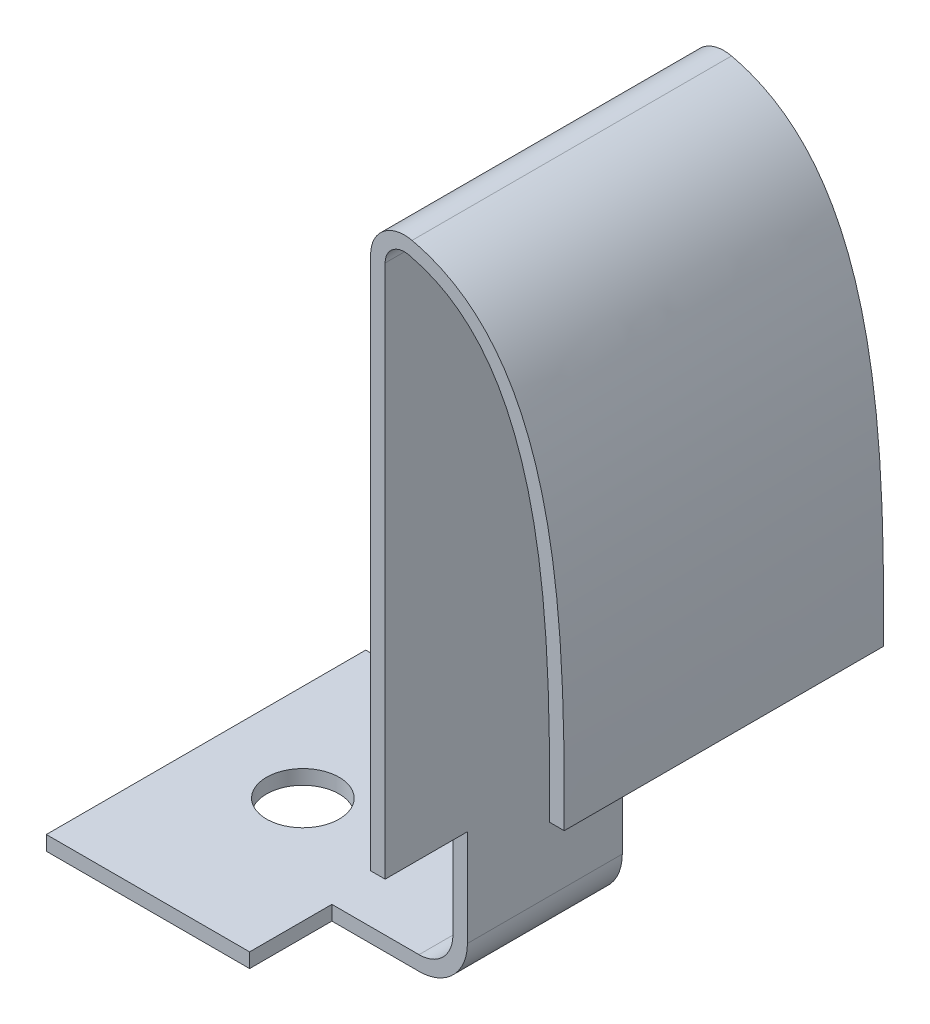
ISO-10303-21;
HEADER;
FILE_DESCRIPTION(('STEP AP214'),'2;1');
FILE_NAME('part.step','',(''),(''),'','','');
FILE_SCHEMA(('AUTOMOTIVE_DESIGN { 1 0 10303 214 1 1 1 1 }'));
ENDSEC;
DATA;
#1=APPLICATION_CONTEXT('core data for automotive mechanical design processes');
#2=APPLICATION_PROTOCOL_DEFINITION('international standard','automotive_design',2000,#1);
#3=PRODUCT_CONTEXT('',#1,'mechanical');
#4=PRODUCT('Part','Part','',(#3));
#5=PRODUCT_RELATED_PRODUCT_CATEGORY('part','',(#4));
#6=PRODUCT_DEFINITION_FORMATION('','',#4);
#7=PRODUCT_DEFINITION_CONTEXT('part definition',#1,'design');
#8=PRODUCT_DEFINITION('design','',#6,#7);
#9=PRODUCT_DEFINITION_SHAPE('','',#8);
#10=(LENGTH_UNIT() NAMED_UNIT(*) SI_UNIT(.MILLI.,.METRE.));
#11=(NAMED_UNIT(*) PLANE_ANGLE_UNIT() SI_UNIT($,.RADIAN.));
#12=(NAMED_UNIT(*) SI_UNIT($,.STERADIAN.) SOLID_ANGLE_UNIT());
#13=UNCERTAINTY_MEASURE_WITH_UNIT(LENGTH_MEASURE(1.E-05),#10,'distance_accuracy_value','');
#14=(GEOMETRIC_REPRESENTATION_CONTEXT(3) GLOBAL_UNCERTAINTY_ASSIGNED_CONTEXT((#13)) GLOBAL_UNIT_ASSIGNED_CONTEXT((#10,
#11,#12)) REPRESENTATION_CONTEXT('',''));
#15=CARTESIAN_POINT('',(0.,0.,0.));
#16=DIRECTION('',(0.,0.,1.));
#17=DIRECTION('',(1.,0.,0.));
#18=AXIS2_PLACEMENT_3D('',#15,#16,#17);
#19=CARTESIAN_POINT('',(-0.7,0.7,3.3));
#20=DIRECTION('',(0.,0.,-1.));
#21=DIRECTION('',(-1.,0.,0.));
#22=AXIS2_PLACEMENT_3D('',#19,#20,#21);
#23=CYLINDRICAL_SURFACE('',#22,1.);
#24=CARTESIAN_POINT('',(-0.7,0.7,-1.6));
#25=DIRECTION('',(0.,0.,-1.));
#26=DIRECTION('',(-1.,0.,0.));
#27=AXIS2_PLACEMENT_3D('',#24,#25,#26);
#28=CIRCLE('',#27,1.);
#29=CARTESIAN_POINT('',(0.3,0.700000000000007,-1.6));
#30=VERTEX_POINT('',#29);
#31=CARTESIAN_POINT('',(-0.700000000000005,-0.3,-1.6));
#32=VERTEX_POINT('',#31);
#33=EDGE_CURVE('E434',#30,#32,#28,.T.);
#34=ORIENTED_EDGE('',*,*,#33,.F.);
#35=DIRECTION('',(0.,0.,-1.));
#36=VECTOR('',#35,1.);
#37=CARTESIAN_POINT('',(0.3,0.700000000000007,3.3));
#38=LINE('',#37,#36);
#39=CARTESIAN_POINT('',(0.3,0.700000000000007,1.6));
#40=VERTEX_POINT('',#39);
#41=EDGE_CURVE('E254',#40,#30,#38,.T.);
#42=ORIENTED_EDGE('',*,*,#41,.F.);
#43=CARTESIAN_POINT('',(-0.7,0.7,1.6));
#44=DIRECTION('',(0.,0.,1.));
#45=DIRECTION('',(1.,0.,0.));
#46=AXIS2_PLACEMENT_3D('',#43,#44,#45);
#47=CIRCLE('',#46,1.);
#48=CARTESIAN_POINT('',(-0.700000000000005,-0.3,1.6));
#49=VERTEX_POINT('',#48);
#50=EDGE_CURVE('E357',#49,#40,#47,.T.);
#51=ORIENTED_EDGE('',*,*,#50,.F.);
#52=DIRECTION('',(0.,0.,-1.));
#53=VECTOR('',#52,1.);
#54=CARTESIAN_POINT('',(-0.700000000000005,-0.3,3.3));
#55=LINE('',#54,#53);
#56=EDGE_CURVE('E258',#49,#32,#55,.T.);
#57=ORIENTED_EDGE('',*,*,#56,.T.);
#58=EDGE_LOOP('',(#34,#42,#51,#57));
#59=FACE_BOUND('',#58,.T.);
#60=ADVANCED_FACE('F44',(#59),#23,.T.);
#61=CARTESIAN_POINT('',(-0.7,0.7,3.3));
#62=DIRECTION('',(0.,0.,-1.));
#63=DIRECTION('',(-1.,0.,0.));
#64=AXIS2_PLACEMENT_3D('',#61,#62,#63);
#65=CYLINDRICAL_SURFACE('',#64,0.7);
#66=CARTESIAN_POINT('',(-0.7,0.7,-1.6));
#67=DIRECTION('',(0.,0.,-1.));
#68=DIRECTION('',(-1.,0.,0.));
#69=AXIS2_PLACEMENT_3D('',#66,#67,#68);
#70=CIRCLE('',#69,0.7);
#71=CARTESIAN_POINT('',(-0.700000000000005,0.,-1.6));
#72=VERTEX_POINT('',#71);
#73=CARTESIAN_POINT('',(0.,0.7,-1.6));
#74=VERTEX_POINT('',#73);
#75=EDGE_CURVE('E293',#72,#74,#70,.F.);
#76=ORIENTED_EDGE('',*,*,#75,.F.);
#77=DIRECTION('',(0.,0.,-1.));
#78=VECTOR('',#77,1.);
#79=CARTESIAN_POINT('',(-0.700000000000005,0.,3.3));
#80=LINE('',#79,#78);
#81=CARTESIAN_POINT('',(-0.700000000000005,0.,1.6));
#82=VERTEX_POINT('',#81);
#83=EDGE_CURVE('E222',#82,#72,#80,.T.);
#84=ORIENTED_EDGE('',*,*,#83,.F.);
#85=CARTESIAN_POINT('',(-0.7,0.7,1.6));
#86=DIRECTION('',(0.,0.,1.));
#87=DIRECTION('',(1.,0.,0.));
#88=AXIS2_PLACEMENT_3D('',#85,#86,#87);
#89=CIRCLE('',#88,0.7);
#90=CARTESIAN_POINT('',(0.,0.7,1.6));
#91=VERTEX_POINT('',#90);
#92=EDGE_CURVE('E458',#91,#82,#89,.F.);
#93=ORIENTED_EDGE('',*,*,#92,.F.);
#94=DIRECTION('',(0.,0.,-1.));
#95=VECTOR('',#94,1.);
#96=CARTESIAN_POINT('',(0.,0.7,3.3));
#97=LINE('',#96,#95);
#98=EDGE_CURVE('E226',#91,#74,#97,.T.);
#99=ORIENTED_EDGE('',*,*,#98,.T.);
#100=EDGE_LOOP('',(#76,#84,#93,#99));
#101=FACE_BOUND('',#100,.T.);
#102=ADVANCED_FACE('F403',(#101),#65,.F.);
#103=CARTESIAN_POINT('',(-0.700000000000005,-0.3,3.3));
#104=DIRECTION('',(0.,1.,0.));
#105=DIRECTION('',(-1.,0.,0.));
#106=AXIS2_PLACEMENT_3D('',#103,#104,#105);
#107=PLANE('',#106);
#108=CARTESIAN_POINT('',(-4.7,-0.300000000000002,0.));
#109=DIRECTION('',(0.,1.,0.));
#110=DIRECTION('',(-1.,0.,0.));
#111=AXIS2_PLACEMENT_3D('',#108,#109,#110);
#112=CIRCLE('',#111,0.749999999999999);
#113=CARTESIAN_POINT('',(-5.45,-0.300000000000002,0.));
#114=VERTEX_POINT('',#113);
#115=EDGE_CURVE('E417',#114,#114,#112,.T.);
#116=ORIENTED_EDGE('',*,*,#115,.T.);
#117=EDGE_LOOP('',(#116));
#118=FACE_BOUND('',#117,.T.);
#119=DIRECTION('',(0.,0.,-1.));
#120=VECTOR('',#119,1.);
#121=CARTESIAN_POINT('',(-2.5,-0.3,3.3));
#122=LINE('',#121,#120);
#123=CARTESIAN_POINT('',(-2.5,-0.3,-1.6));
#124=VERTEX_POINT('',#123);
#125=CARTESIAN_POINT('',(-2.5,-0.3,-3.3));
#126=VERTEX_POINT('',#125);
#127=EDGE_CURVE('E60',#124,#126,#122,.T.);
#128=ORIENTED_EDGE('',*,*,#127,.F.);
#129=DIRECTION('',(-1.,0.,0.));
#130=VECTOR('',#129,1.);
#131=CARTESIAN_POINT('',(-0.700000000000005,-0.3,-1.6));
#132=LINE('',#131,#130);
#133=EDGE_CURVE('E420',#32,#124,#132,.T.);
#134=ORIENTED_EDGE('',*,*,#133,.F.);
#135=ORIENTED_EDGE('',*,*,#56,.F.);
#136=DIRECTION('',(1.,0.,0.));
#137=VECTOR('',#136,1.);
#138=CARTESIAN_POINT('',(-0.700000000000005,-0.3,1.6));
#139=LINE('',#138,#137);
#140=CARTESIAN_POINT('',(-2.5,-0.3,1.6));
#141=VERTEX_POINT('',#140);
#142=EDGE_CURVE('E353',#141,#49,#139,.T.);
#143=ORIENTED_EDGE('',*,*,#142,.F.);
#144=DIRECTION('',(0.,0.,1.));
#145=VECTOR('',#144,1.);
#146=CARTESIAN_POINT('',(-2.5,-0.3,3.3));
#147=LINE('',#146,#145);
#148=CARTESIAN_POINT('',(-2.5,-0.300000000000001,3.3));
#149=VERTEX_POINT('',#148);
#150=EDGE_CURVE('E454',#141,#149,#147,.T.);
#151=ORIENTED_EDGE('',*,*,#150,.T.);
#152=DIRECTION('',(1.,0.,0.));
#153=VECTOR('',#152,1.);
#154=CARTESIAN_POINT('',(-0.700000000000005,-0.3,3.3));
#155=LINE('',#154,#153);
#156=CARTESIAN_POINT('',(-6.7,-0.300000000000001,3.3));
#157=VERTEX_POINT('',#156);
#158=EDGE_CURVE('E212',#157,#149,#155,.T.);
#159=ORIENTED_EDGE('',*,*,#158,.F.);
#160=DIRECTION('',(0.,0.,-1.));
#161=VECTOR('',#160,1.);
#162=CARTESIAN_POINT('',(-6.7,-0.300000000000001,3.3));
#163=LINE('',#162,#161);
#164=CARTESIAN_POINT('',(-6.7,-0.300000000000001,-3.3));
#165=VERTEX_POINT('',#164);
#166=EDGE_CURVE('E262',#157,#165,#163,.T.);
#167=ORIENTED_EDGE('',*,*,#166,.T.);
#168=DIRECTION('',(1.,0.,0.));
#169=VECTOR('',#168,1.);
#170=CARTESIAN_POINT('',(-0.700000000000005,-0.3,-3.3));
#171=LINE('',#170,#169);
#172=EDGE_CURVE('E300',#165,#126,#171,.T.);
#173=ORIENTED_EDGE('',*,*,#172,.T.);
#174=EDGE_LOOP('',(#128,#134,#135,#143,#151,#159,#167,#173));
#175=FACE_BOUND('',#174,.T.);
#176=ADVANCED_FACE('F401',(#118,#175),#107,.F.);
#177=CARTESIAN_POINT('',(0.3,0.700000000000007,3.3));
#178=DIRECTION('',(-1.,0.,0.));
#179=DIRECTION('',(0.,-1.,0.));
#180=AXIS2_PLACEMENT_3D('',#177,#178,#179);
#181=PLANE('',#180);
#182=DIRECTION('',(0.,0.,1.));
#183=VECTOR('',#182,1.);
#184=CARTESIAN_POINT('',(0.3,2.7,3.3));
#185=LINE('',#184,#183);
#186=CARTESIAN_POINT('',(0.3,2.7,-3.3));
#187=VERTEX_POINT('',#186);
#188=CARTESIAN_POINT('',(0.3,2.7,-1.6));
#189=VERTEX_POINT('',#188);
#190=EDGE_CURVE('E279',#187,#189,#185,.T.);
#191=ORIENTED_EDGE('',*,*,#190,.F.);
#192=DIRECTION('',(0.,1.,0.));
#193=VECTOR('',#192,1.);
#194=CARTESIAN_POINT('',(0.3,0.700000000000007,-3.3));
#195=LINE('',#194,#193);
#196=CARTESIAN_POINT('',(0.3,13.7257686805436,-3.3));
#197=VERTEX_POINT('',#196);
#198=EDGE_CURVE('E290',#187,#197,#195,.T.);
#199=ORIENTED_EDGE('',*,*,#198,.T.);
#200=DIRECTION('',(0.,0.,-1.));
#201=VECTOR('',#200,1.);
#202=CARTESIAN_POINT('',(0.3,13.7257686805436,3.3));
#203=LINE('',#202,#201);
#204=CARTESIAN_POINT('',(0.3,13.7257686805436,3.3));
#205=VERTEX_POINT('',#204);
#206=EDGE_CURVE('E250',#205,#197,#203,.T.);
#207=ORIENTED_EDGE('',*,*,#206,.F.);
#208=DIRECTION('',(0.,1.,0.));
#209=VECTOR('',#208,1.);
#210=CARTESIAN_POINT('',(0.3,0.700000000000007,3.3));
#211=LINE('',#210,#209);
#212=CARTESIAN_POINT('',(0.3,2.7,3.3));
#213=VERTEX_POINT('',#212);
#214=EDGE_CURVE('E371',#213,#205,#211,.T.);
#215=ORIENTED_EDGE('',*,*,#214,.F.);
#216=DIRECTION('',(0.,0.,-1.));
#217=VECTOR('',#216,1.);
#218=CARTESIAN_POINT('',(0.3,2.7,3.3));
#219=LINE('',#218,#217);
#220=CARTESIAN_POINT('',(0.3,2.7,1.6));
#221=VERTEX_POINT('',#220);
#222=EDGE_CURVE('E68',#213,#221,#219,.T.);
#223=ORIENTED_EDGE('',*,*,#222,.T.);
#224=DIRECTION('',(0.,1.,0.));
#225=VECTOR('',#224,1.);
#226=CARTESIAN_POINT('',(0.3,0.700000000000007,1.6));
#227=LINE('',#226,#225);
#228=EDGE_CURVE('E364',#40,#221,#227,.T.);
#229=ORIENTED_EDGE('',*,*,#228,.F.);
#230=ORIENTED_EDGE('',*,*,#41,.T.);
#231=DIRECTION('',(0.,-1.,0.));
#232=VECTOR('',#231,1.);
#233=CARTESIAN_POINT('',(0.3,0.700000000000007,-1.6));
#234=LINE('',#233,#232);
#235=EDGE_CURVE('E291',#189,#30,#234,.T.);
#236=ORIENTED_EDGE('',*,*,#235,.F.);
#237=EDGE_LOOP('',(#191,#199,#207,#215,#223,#229,#230,#236));
#238=FACE_BOUND('',#237,.T.);
#239=ADVANCED_FACE('F288',(#238),#181,.F.);
#240=CARTESIAN_POINT('',(0.,0.700000000000005,3.3));
#241=DIRECTION('',(1.,0.,0.));
#242=DIRECTION('',(0.,0.,-1.));
#243=AXIS2_PLACEMENT_3D('',#240,#241,#242);
#244=PLANE('',#243);
#245=DIRECTION('',(0.,0.,-1.));
#246=VECTOR('',#245,1.);
#247=CARTESIAN_POINT('',(0.,2.7,3.3));
#248=LINE('',#247,#246);
#249=CARTESIAN_POINT('',(0.,2.7,-1.6));
#250=VERTEX_POINT('',#249);
#251=CARTESIAN_POINT('',(0.,2.7,-3.3));
#252=VERTEX_POINT('',#251);
#253=EDGE_CURVE('E282',#250,#252,#248,.T.);
#254=ORIENTED_EDGE('',*,*,#253,.F.);
#255=DIRECTION('',(0.,1.,0.));
#256=VECTOR('',#255,1.);
#257=CARTESIAN_POINT('',(0.,0.700000000000005,-1.6));
#258=LINE('',#257,#256);
#259=EDGE_CURVE('E429',#74,#250,#258,.T.);
#260=ORIENTED_EDGE('',*,*,#259,.F.);
#261=ORIENTED_EDGE('',*,*,#98,.F.);
#262=DIRECTION('',(0.,-1.,0.));
#263=VECTOR('',#262,1.);
#264=CARTESIAN_POINT('',(0.,0.700000000000005,1.6));
#265=LINE('',#264,#263);
#266=CARTESIAN_POINT('',(0.,2.7,1.6));
#267=VERTEX_POINT('',#266);
#268=EDGE_CURVE('E461',#267,#91,#265,.T.);
#269=ORIENTED_EDGE('',*,*,#268,.F.);
#270=DIRECTION('',(0.,0.,1.));
#271=VECTOR('',#270,1.);
#272=CARTESIAN_POINT('',(0.,2.7,3.3));
#273=LINE('',#272,#271);
#274=CARTESIAN_POINT('',(0.,2.7,3.3));
#275=VERTEX_POINT('',#274);
#276=EDGE_CURVE('E341',#267,#275,#273,.T.);
#277=ORIENTED_EDGE('',*,*,#276,.T.);
#278=DIRECTION('',(0.,-1.,0.));
#279=VECTOR('',#278,1.);
#280=CARTESIAN_POINT('',(0.,0.700000000000005,3.3));
#281=LINE('',#280,#279);
#282=CARTESIAN_POINT('',(0.,13.7257686805436,3.3));
#283=VERTEX_POINT('',#282);
#284=EDGE_CURVE('E339',#283,#275,#281,.T.);
#285=ORIENTED_EDGE('',*,*,#284,.F.);
#286=DIRECTION('',(0.,0.,-1.));
#287=VECTOR('',#286,1.);
#288=CARTESIAN_POINT('',(0.,13.7257686805436,3.3));
#289=LINE('',#288,#287);
#290=CARTESIAN_POINT('',(0.,13.7257686805436,-3.3));
#291=VERTEX_POINT('',#290);
#292=EDGE_CURVE('E230',#283,#291,#289,.T.);
#293=ORIENTED_EDGE('',*,*,#292,.T.);
#294=DIRECTION('',(0.,-1.,0.));
#295=VECTOR('',#294,1.);
#296=CARTESIAN_POINT('',(0.,0.700000000000005,-3.3));
#297=LINE('',#296,#295);
#298=EDGE_CURVE('E207',#291,#252,#297,.T.);
#299=ORIENTED_EDGE('',*,*,#298,.T.);
#300=EDGE_LOOP('',(#254,#260,#261,#269,#277,#285,#293,#299));
#301=FACE_BOUND('',#300,.T.);
#302=ADVANCED_FACE('F336',(#301),#244,.F.);
#303=CARTESIAN_POINT('',(-0.700000000000005,0.,3.3));
#304=DIRECTION('',(0.,-1.,0.));
#305=DIRECTION('',(1.,0.,0.));
#306=AXIS2_PLACEMENT_3D('',#303,#304,#305);
#307=PLANE('',#306);
#308=CARTESIAN_POINT('',(-4.7,0.,0.));
#309=DIRECTION('',(0.,1.,0.));
#310=DIRECTION('',(-1.,0.,0.));
#311=AXIS2_PLACEMENT_3D('',#308,#309,#310);
#312=CIRCLE('',#311,0.749999999999999);
#313=CARTESIAN_POINT('',(-5.45,0.,0.));
#314=VERTEX_POINT('',#313);
#315=EDGE_CURVE('E525',#314,#314,#312,.T.);
#316=ORIENTED_EDGE('',*,*,#315,.F.);
#317=EDGE_LOOP('',(#316));
#318=FACE_BOUND('',#317,.T.);
#319=DIRECTION('',(0.,0.,1.));
#320=VECTOR('',#319,1.);
#321=CARTESIAN_POINT('',(-2.5,0.,3.3));
#322=LINE('',#321,#320);
#323=CARTESIAN_POINT('',(-2.5,0.,-3.3));
#324=VERTEX_POINT('',#323);
#325=CARTESIAN_POINT('',(-2.5,0.,-1.6));
#326=VERTEX_POINT('',#325);
#327=EDGE_CURVE('E183',#324,#326,#322,.T.);
#328=ORIENTED_EDGE('',*,*,#327,.F.);
#329=DIRECTION('',(-1.,0.,0.));
#330=VECTOR('',#329,1.);
#331=CARTESIAN_POINT('',(-0.700000000000005,0.,-3.3));
#332=LINE('',#331,#330);
#333=CARTESIAN_POINT('',(-6.7,0.,-3.3));
#334=VERTEX_POINT('',#333);
#335=EDGE_CURVE('E195',#324,#334,#332,.T.);
#336=ORIENTED_EDGE('',*,*,#335,.T.);
#337=DIRECTION('',(0.,0.,-1.));
#338=VECTOR('',#337,1.);
#339=CARTESIAN_POINT('',(-6.7,0.,3.3));
#340=LINE('',#339,#338);
#341=CARTESIAN_POINT('',(-6.7,0.,3.3));
#342=VERTEX_POINT('',#341);
#343=EDGE_CURVE('E219',#342,#334,#340,.T.);
#344=ORIENTED_EDGE('',*,*,#343,.F.);
#345=DIRECTION('',(-1.,0.,0.));
#346=VECTOR('',#345,1.);
#347=CARTESIAN_POINT('',(-0.700000000000005,0.,3.3));
#348=LINE('',#347,#346);
#349=CARTESIAN_POINT('',(-2.5,0.,3.3));
#350=VERTEX_POINT('',#349);
#351=EDGE_CURVE('E223',#350,#342,#348,.T.);
#352=ORIENTED_EDGE('',*,*,#351,.F.);
#353=DIRECTION('',(0.,0.,-1.));
#354=VECTOR('',#353,1.);
#355=CARTESIAN_POINT('',(-2.5,0.,3.3));
#356=LINE('',#355,#354);
#357=CARTESIAN_POINT('',(-2.5,0.,1.6));
#358=VERTEX_POINT('',#357);
#359=EDGE_CURVE('E450',#350,#358,#356,.T.);
#360=ORIENTED_EDGE('',*,*,#359,.T.);
#361=DIRECTION('',(-1.,0.,0.));
#362=VECTOR('',#361,1.);
#363=CARTESIAN_POINT('',(-0.700000000000005,0.,1.6));
#364=LINE('',#363,#362);
#365=EDGE_CURVE('E189',#82,#358,#364,.T.);
#366=ORIENTED_EDGE('',*,*,#365,.F.);
#367=ORIENTED_EDGE('',*,*,#83,.T.);
#368=DIRECTION('',(1.,0.,0.));
#369=VECTOR('',#368,1.);
#370=CARTESIAN_POINT('',(-0.700000000000005,0.,-1.6));
#371=LINE('',#370,#369);
#372=EDGE_CURVE('E11',#326,#72,#371,.T.);
#373=ORIENTED_EDGE('',*,*,#372,.F.);
#374=EDGE_LOOP('',(#328,#336,#344,#352,#360,#366,#367,#373));
#375=FACE_BOUND('',#374,.T.);
#376=ADVANCED_FACE('F193',(#318,#375),#307,.F.);
#377=CARTESIAN_POINT('',(-0.7,0.7,-3.3));
#378=DIRECTION('',(0.,0.,1.));
#379=DIRECTION('',(1.,0.,0.));
#380=AXIS2_PLACEMENT_3D('',#377,#378,#379);
#381=PLANE('',#380);
#382=DIRECTION('',(1.,0.,0.));
#383=VECTOR('',#382,1.);
#384=CARTESIAN_POINT('',(-0.7,2.7,-3.3));
#385=LINE('',#384,#383);
#386=EDGE_CURVE('E53',#252,#187,#385,.T.);
#387=ORIENTED_EDGE('',*,*,#386,.F.);
#388=ORIENTED_EDGE('',*,*,#298,.F.);
#389=CARTESIAN_POINT('',(0.7,13.7257686805436,-3.3));
#390=DIRECTION('',(0.,0.,1.));
#391=DIRECTION('',(-1.,0.,0.));
#392=AXIS2_PLACEMENT_3D('',#389,#390,#391);
#393=CIRCLE('',#392,0.7);
#394=CARTESIAN_POINT('',(0.856289406455521,14.4080982353994,-3.3));
#395=VERTEX_POINT('',#394);
#396=EDGE_CURVE('E215',#395,#291,#393,.T.);
#397=ORIENTED_EDGE('',*,*,#396,.F.);
#398=CARTESIAN_POINT('',(4.,5.41782178217822,-3.3));
#399=CARTESIAN_POINT('',(4.,8.84009346286492,-3.3));
#400=CARTESIAN_POINT('',(4.01626981396625,13.6842962854674,-3.3));
#401=CARTESIAN_POINT('',(0.85628940645552,14.4080982353994,-3.3));
#402=B_SPLINE_CURVE_WITH_KNOTS('',3,(#398,#399,#400,#401),.UNSPECIFIED.,.F.,.F.,(4,4),(0.,1.),.UNSPECIFIED.);
#403=CARTESIAN_POINT('',(4.,5.41782178217822,-3.3));
#404=VERTEX_POINT('',#403);
#405=EDGE_CURVE('E319',#404,#395,#402,.T.);
#406=ORIENTED_EDGE('',*,*,#405,.F.);
#407=DIRECTION('',(1.,0.,0.));
#408=VECTOR('',#407,1.);
#409=CARTESIAN_POINT('',(3.7,5.41782178217822,-3.3));
#410=LINE('',#409,#408);
#411=CARTESIAN_POINT('',(3.7,5.41782178217822,-3.3));
#412=VERTEX_POINT('',#411);
#413=EDGE_CURVE('E313',#412,#404,#410,.T.);
#414=ORIENTED_EDGE('',*,*,#413,.F.);
#415=CARTESIAN_POINT('',(0.789308232260298,14.1156712833184,-3.3));
#416=CARTESIAN_POINT('',(0.961165961661601,14.0763068115147,-3.3));
#417=CARTESIAN_POINT('',(1.30645259416978,13.9628538150711,-3.3));
#418=CARTESIAN_POINT('',(1.88022316837982,13.638820469936,-3.3));
#419=CARTESIAN_POINT('',(2.70466413126988,12.8117795488323,-3.3));
#420=CARTESIAN_POINT('',(3.41463846111716,10.9528080534304,-3.3));
#421=CARTESIAN_POINT('',(3.65402592519503,8.62348096684369,-3.3));
#422=CARTESIAN_POINT('',(3.70047539717855,6.73535819668818,-3.3));
#423=CARTESIAN_POINT('',(3.7,5.86297770085045,-3.3));
#424=CARTESIAN_POINT('',(3.7,5.41782178217822,-3.3));
#425=B_SPLINE_CURVE_WITH_KNOTS('',3,(#415,#416,#417,#418,#419,#420,#421,#422,#423,#424),
.UNSPECIFIED.,.F.,.F.,(4,1,1,1,1,1,1,4),(0.,0.0625,0.125,0.25,0.5,0.75,0.875,1.),.UNSPECIFIED.);
#426=CARTESIAN_POINT('',(0.789308232260298,14.1156712833184,-3.3));
#427=VERTEX_POINT('',#426);
#428=EDGE_CURVE('E304',#427,#412,#425,.T.);
#429=ORIENTED_EDGE('',*,*,#428,.F.);
#430=CARTESIAN_POINT('',(0.7,13.7257686805436,-3.3));
#431=DIRECTION('',(0.,0.,-1.));
#432=DIRECTION('',(-1.,0.,0.));
#433=AXIS2_PLACEMENT_3D('',#430,#431,#432);
#434=CIRCLE('',#433,0.4);
#435=EDGE_CURVE('E298',#197,#427,#434,.T.);
#436=ORIENTED_EDGE('',*,*,#435,.F.);
#437=ORIENTED_EDGE('',*,*,#198,.F.);
#438=EDGE_LOOP('',(#387,#388,#397,#406,#414,#429,#436,#437));
#439=FACE_BOUND('',#438,.T.);
#440=ADVANCED_FACE('F296',(#439),#381,.F.);
#441=DIRECTION('',(0.,1.,0.));
#442=VECTOR('',#441,1.);
#443=CARTESIAN_POINT('',(-2.5,0.7,-3.3));
#444=LINE('',#443,#442);
#445=EDGE_CURVE('E180',#126,#324,#444,.T.);
#446=ORIENTED_EDGE('',*,*,#445,.F.);
#447=ORIENTED_EDGE('',*,*,#172,.F.);
#448=DIRECTION('',(0.,-1.,0.));
#449=VECTOR('',#448,1.);
#450=CARTESIAN_POINT('',(-6.7,0.,-3.3));
#451=LINE('',#450,#449);
#452=EDGE_CURVE('E204',#334,#165,#451,.T.);
#453=ORIENTED_EDGE('',*,*,#452,.F.);
#454=ORIENTED_EDGE('',*,*,#335,.F.);
#455=EDGE_LOOP('',(#446,#447,#453,#454));
#456=FACE_BOUND('',#455,.T.);
#457=ADVANCED_FACE('F202',(#456),#381,.F.);
#458=CARTESIAN_POINT('',(-0.7,0.7,3.3));
#459=DIRECTION('',(0.,0.,1.));
#460=DIRECTION('',(1.,0.,0.));
#461=AXIS2_PLACEMENT_3D('',#458,#459,#460);
#462=PLANE('',#461);
#463=DIRECTION('',(0.,-1.,0.));
#464=VECTOR('',#463,1.);
#465=CARTESIAN_POINT('',(-2.5,0.7,3.3));
#466=LINE('',#465,#464);
#467=EDGE_CURVE('E269',#350,#149,#466,.T.);
#468=ORIENTED_EDGE('',*,*,#467,.F.);
#469=ORIENTED_EDGE('',*,*,#351,.T.);
#470=DIRECTION('',(0.,-1.,0.));
#471=VECTOR('',#470,1.);
#472=CARTESIAN_POINT('',(-6.7,0.,3.3));
#473=LINE('',#472,#471);
#474=EDGE_CURVE('E206',#342,#157,#473,.T.);
#475=ORIENTED_EDGE('',*,*,#474,.T.);
#476=ORIENTED_EDGE('',*,*,#158,.T.);
#477=EDGE_LOOP('',(#468,#469,#475,#476));
#478=FACE_BOUND('',#477,.T.);
#479=ADVANCED_FACE('F501',(#478),#462,.T.);
#480=CARTESIAN_POINT('',(-6.7,0.,3.3));
#481=DIRECTION('',(1.,0.,0.));
#482=DIRECTION('',(0.,0.,-1.));
#483=AXIS2_PLACEMENT_3D('',#480,#481,#482);
#484=PLANE('',#483);
#485=ORIENTED_EDGE('',*,*,#452,.T.);
#486=ORIENTED_EDGE('',*,*,#166,.F.);
#487=ORIENTED_EDGE('',*,*,#474,.F.);
#488=ORIENTED_EDGE('',*,*,#343,.T.);
#489=EDGE_LOOP('',(#485,#486,#487,#488));
#490=FACE_BOUND('',#489,.T.);
#491=ADVANCED_FACE('F46',(#490),#484,.F.);
#492=CARTESIAN_POINT('',(0.7,13.7257686805436,3.3));
#493=DIRECTION('',(0.,0.,-1.));
#494=DIRECTION('',(-1.,0.,0.));
#495=AXIS2_PLACEMENT_3D('',#492,#493,#494);
#496=CYLINDRICAL_SURFACE('',#495,0.4);
#497=ORIENTED_EDGE('',*,*,#435,.T.);
#498=DIRECTION('',(0.,0.,-1.));
#499=VECTOR('',#498,1.);
#500=CARTESIAN_POINT('',(0.789308232260298,14.1156712833184,3.3));
#501=LINE('',#500,#499);
#502=CARTESIAN_POINT('',(0.789308232260298,14.1156712833184,3.3));
#503=VERTEX_POINT('',#502);
#504=EDGE_CURVE('E246',#503,#427,#501,.T.);
#505=ORIENTED_EDGE('',*,*,#504,.F.);
#506=CARTESIAN_POINT('',(0.7,13.7257686805436,3.3));
#507=DIRECTION('',(0.,0.,-1.));
#508=DIRECTION('',(-1.,0.,0.));
#509=AXIS2_PLACEMENT_3D('',#506,#507,#508);
#510=CIRCLE('',#509,0.4);
#511=EDGE_CURVE('E374',#205,#503,#510,.T.);
#512=ORIENTED_EDGE('',*,*,#511,.F.);
#513=ORIENTED_EDGE('',*,*,#206,.T.);
#514=EDGE_LOOP('',(#497,#505,#512,#513));
#515=FACE_BOUND('',#514,.T.);
#516=ADVANCED_FACE('F393',(#515),#496,.F.);
#517=CARTESIAN_POINT('',(0.789308232260298,14.1156712833184,3.3));
#518=CARTESIAN_POINT('',(0.961165961661601,14.0763068115147,3.3));
#519=CARTESIAN_POINT('',(1.30645259416978,13.9628538150711,3.3));
#520=CARTESIAN_POINT('',(1.88022316837982,13.638820469936,3.3));
#521=CARTESIAN_POINT('',(2.70466413126988,12.8117795488323,3.3));
#522=CARTESIAN_POINT('',(3.41463846111716,10.9528080534304,3.3));
#523=CARTESIAN_POINT('',(3.65402592519503,8.62348096684369,3.3));
#524=CARTESIAN_POINT('',(3.70047539717855,6.73535819668818,3.3));
#525=CARTESIAN_POINT('',(3.7,5.86297770085045,3.3));
#526=CARTESIAN_POINT('',(3.7,5.41782178217822,3.3));
#527=B_SPLINE_CURVE_WITH_KNOTS('',3,(#517,#518,#519,#520,#521,#522,#523,#524,#525,#526),
.UNSPECIFIED.,.F.,.F.,(4,1,1,1,1,1,1,4),(0.,0.0625,0.125,0.25,0.5,0.75,0.875,1.),.UNSPECIFIED.);
#528=DIRECTION('',(0.,0.,-1.));
#529=VECTOR('',#528,1.);
#530=SURFACE_OF_LINEAR_EXTRUSION('',#527,#529);
#531=ORIENTED_EDGE('',*,*,#428,.T.);
#532=DIRECTION('',(0.,0.,-1.));
#533=VECTOR('',#532,1.);
#534=CARTESIAN_POINT('',(3.7,5.41782178217822,3.3));
#535=LINE('',#534,#533);
#536=CARTESIAN_POINT('',(3.7,5.41782178217822,3.3));
#537=VERTEX_POINT('',#536);
#538=EDGE_CURVE('E242',#537,#412,#535,.T.);
#539=ORIENTED_EDGE('',*,*,#538,.F.);
#540=EDGE_CURVE('E377',#503,#537,#527,.T.);
#541=ORIENTED_EDGE('',*,*,#540,.F.);
#542=ORIENTED_EDGE('',*,*,#504,.T.);
#543=EDGE_LOOP('',(#531,#539,#541,#542));
#544=FACE_BOUND('',#543,.T.);
#545=ADVANCED_FACE('F388',(#544),#530,.F.);
#546=CARTESIAN_POINT('',(3.7,5.41782178217822,3.3));
#547=DIRECTION('',(0.,1.,0.));
#548=DIRECTION('',(0.,0.,1.));
#549=AXIS2_PLACEMENT_3D('',#546,#547,#548);
#550=PLANE('',#549);
#551=ORIENTED_EDGE('',*,*,#413,.T.);
#552=DIRECTION('',(0.,0.,-1.));
#553=VECTOR('',#552,1.);
#554=CARTESIAN_POINT('',(4.,5.41782178217822,3.3));
#555=LINE('',#554,#553);
#556=CARTESIAN_POINT('',(4.,5.41782178217822,3.3));
#557=VERTEX_POINT('',#556);
#558=EDGE_CURVE('E238',#557,#404,#555,.T.);
#559=ORIENTED_EDGE('',*,*,#558,.F.);
#560=DIRECTION('',(1.,0.,0.));
#561=VECTOR('',#560,1.);
#562=CARTESIAN_POINT('',(3.7,5.41782178217822,3.3));
#563=LINE('',#562,#561);
#564=EDGE_CURVE('E383',#537,#557,#563,.T.);
#565=ORIENTED_EDGE('',*,*,#564,.F.);
#566=ORIENTED_EDGE('',*,*,#538,.T.);
#567=EDGE_LOOP('',(#551,#559,#565,#566));
#568=FACE_BOUND('',#567,.T.);
#569=ADVANCED_FACE('F392',(#568),#550,.F.);
#570=CARTESIAN_POINT('',(4.,5.41782178217822,3.3));
#571=CARTESIAN_POINT('',(4.,8.84009346286492,3.3));
#572=CARTESIAN_POINT('',(4.01626981396625,13.6842962854674,3.3));
#573=CARTESIAN_POINT('',(0.85628940645552,14.4080982353994,3.3));
#574=B_SPLINE_CURVE_WITH_KNOTS('',3,(#570,#571,#572,#573),.UNSPECIFIED.,.F.,.F.,(4,4),(0.,1.),.UNSPECIFIED.);
#575=DIRECTION('',(0.,0.,-1.));
#576=VECTOR('',#575,1.);
#577=SURFACE_OF_LINEAR_EXTRUSION('',#574,#576);
#578=ORIENTED_EDGE('',*,*,#405,.T.);
#579=DIRECTION('',(0.,0.,-1.));
#580=VECTOR('',#579,1.);
#581=CARTESIAN_POINT('',(0.856289406455521,14.4080982353994,3.3));
#582=LINE('',#581,#580);
#583=CARTESIAN_POINT('',(0.856289406455521,14.4080982353994,3.3));
#584=VERTEX_POINT('',#583);
#585=EDGE_CURVE('E234',#584,#395,#582,.T.);
#586=ORIENTED_EDGE('',*,*,#585,.F.);
#587=EDGE_CURVE('E349',#557,#584,#574,.T.);
#588=ORIENTED_EDGE('',*,*,#587,.F.);
#589=ORIENTED_EDGE('',*,*,#558,.T.);
#590=EDGE_LOOP('',(#578,#586,#588,#589));
#591=FACE_BOUND('',#590,.T.);
#592=ADVANCED_FACE('F487',(#591),#577,.F.);
#593=CARTESIAN_POINT('',(0.7,13.7257686805436,3.3));
#594=DIRECTION('',(0.,0.,-1.));
#595=DIRECTION('',(-1.,0.,0.));
#596=AXIS2_PLACEMENT_3D('',#593,#594,#595);
#597=CYLINDRICAL_SURFACE('',#596,0.7);
#598=ORIENTED_EDGE('',*,*,#396,.T.);
#599=ORIENTED_EDGE('',*,*,#292,.F.);
#600=CARTESIAN_POINT('',(0.7,13.7257686805436,3.3));
#601=DIRECTION('',(0.,0.,1.));
#602=DIRECTION('',(-1.,0.,0.));
#603=AXIS2_PLACEMENT_3D('',#600,#601,#602);
#604=CIRCLE('',#603,0.7);
#605=EDGE_CURVE('E344',#584,#283,#604,.T.);
#606=ORIENTED_EDGE('',*,*,#605,.F.);
#607=ORIENTED_EDGE('',*,*,#585,.T.);
#608=EDGE_LOOP('',(#598,#599,#606,#607));
#609=FACE_BOUND('',#608,.T.);
#610=ADVANCED_FACE('F330',(#609),#597,.T.);
#611=DIRECTION('',(-1.,0.,0.));
#612=VECTOR('',#611,1.);
#613=CARTESIAN_POINT('',(-0.7,2.7,3.3));
#614=LINE('',#613,#612);
#615=EDGE_CURVE('E266',#213,#275,#614,.T.);
#616=ORIENTED_EDGE('',*,*,#615,.F.);
#617=ORIENTED_EDGE('',*,*,#214,.T.);
#618=ORIENTED_EDGE('',*,*,#511,.T.);
#619=ORIENTED_EDGE('',*,*,#540,.T.);
#620=ORIENTED_EDGE('',*,*,#564,.T.);
#621=ORIENTED_EDGE('',*,*,#587,.T.);
#622=ORIENTED_EDGE('',*,*,#605,.T.);
#623=ORIENTED_EDGE('',*,*,#284,.T.);
#624=EDGE_LOOP('',(#616,#617,#618,#619,#620,#621,#622,#623));
#625=FACE_BOUND('',#624,.T.);
#626=ADVANCED_FACE('F470',(#625),#462,.T.);
#627=CARTESIAN_POINT('',(0.,0.,1.6));
#628=DIRECTION('',(0.,0.,1.));
#629=DIRECTION('',(1.,0.,0.));
#630=AXIS2_PLACEMENT_3D('',#627,#628,#629);
#631=PLANE('',#630);
#632=ORIENTED_EDGE('',*,*,#142,.T.);
#633=ORIENTED_EDGE('',*,*,#50,.T.);
#634=ORIENTED_EDGE('',*,*,#228,.T.);
#635=DIRECTION('',(-1.,0.,0.));
#636=VECTOR('',#635,1.);
#637=CARTESIAN_POINT('',(0.78017354630699,2.7,1.6));
#638=LINE('',#637,#636);
#639=EDGE_CURVE('E439',#221,#267,#638,.T.);
#640=ORIENTED_EDGE('',*,*,#639,.T.);
#641=ORIENTED_EDGE('',*,*,#268,.T.);
#642=ORIENTED_EDGE('',*,*,#92,.T.);
#643=ORIENTED_EDGE('',*,*,#365,.T.);
#644=DIRECTION('',(0.,-1.,0.));
#645=VECTOR('',#644,1.);
#646=CARTESIAN_POINT('',(-2.5,-0.627606579221043,1.6));
#647=LINE('',#646,#645);
#648=EDGE_CURVE('E443',#358,#141,#647,.T.);
#649=ORIENTED_EDGE('',*,*,#648,.T.);
#650=EDGE_LOOP('',(#632,#633,#634,#640,#641,#642,#643,#649));
#651=FACE_BOUND('',#650,.T.);
#652=ADVANCED_FACE('F465',(#651),#631,.T.);
#653=CARTESIAN_POINT('',(-2.5,-0.627606579221043,1.6));
#654=DIRECTION('',(-1.,0.,0.));
#655=DIRECTION('',(0.,0.,1.));
#656=AXIS2_PLACEMENT_3D('',#653,#654,#655);
#657=PLANE('',#656);
#658=ORIENTED_EDGE('',*,*,#648,.F.);
#659=ORIENTED_EDGE('',*,*,#359,.F.);
#660=ORIENTED_EDGE('',*,*,#467,.T.);
#661=ORIENTED_EDGE('',*,*,#150,.F.);
#662=EDGE_LOOP('',(#658,#659,#660,#661));
#663=FACE_BOUND('',#662,.T.);
#664=ADVANCED_FACE('F505',(#663),#657,.F.);
#665=CARTESIAN_POINT('',(0.78017354630699,2.7,1.6));
#666=DIRECTION('',(0.,1.,0.));
#667=DIRECTION('',(-1.,0.,0.));
#668=AXIS2_PLACEMENT_3D('',#665,#666,#667);
#669=PLANE('',#668);
#670=ORIENTED_EDGE('',*,*,#615,.T.);
#671=ORIENTED_EDGE('',*,*,#276,.F.);
#672=ORIENTED_EDGE('',*,*,#639,.F.);
#673=ORIENTED_EDGE('',*,*,#222,.F.);
#674=EDGE_LOOP('',(#670,#671,#672,#673));
#675=FACE_BOUND('',#674,.T.);
#676=ADVANCED_FACE('F467',(#675),#669,.F.);
#677=CARTESIAN_POINT('',(0.,0.,-1.6));
#678=DIRECTION('',(0.,0.,-1.));
#679=DIRECTION('',(1.,0.,0.));
#680=AXIS2_PLACEMENT_3D('',#677,#678,#679);
#681=PLANE('',#680);
#682=ORIENTED_EDGE('',*,*,#133,.T.);
#683=DIRECTION('',(0.,-1.,0.));
#684=VECTOR('',#683,1.);
#685=CARTESIAN_POINT('',(-2.5,-0.627606579221043,-1.6));
#686=LINE('',#685,#684);
#687=EDGE_CURVE('E529',#326,#124,#686,.T.);
#688=ORIENTED_EDGE('',*,*,#687,.F.);
#689=ORIENTED_EDGE('',*,*,#372,.T.);
#690=ORIENTED_EDGE('',*,*,#75,.T.);
#691=ORIENTED_EDGE('',*,*,#259,.T.);
#692=DIRECTION('',(-1.,0.,0.));
#693=VECTOR('',#692,1.);
#694=CARTESIAN_POINT('',(0.78017354630699,2.7,-1.6));
#695=LINE('',#694,#693);
#696=EDGE_CURVE('E199',#189,#250,#695,.T.);
#697=ORIENTED_EDGE('',*,*,#696,.F.);
#698=ORIENTED_EDGE('',*,*,#235,.T.);
#699=ORIENTED_EDGE('',*,*,#33,.T.);
#700=EDGE_LOOP('',(#682,#688,#689,#690,#691,#697,#698,#699));
#701=FACE_BOUND('',#700,.T.);
#702=ADVANCED_FACE('F504',(#701),#681,.T.);
#703=CARTESIAN_POINT('',(0.78017354630699,2.7,-1.6));
#704=DIRECTION('',(0.,-1.,0.));
#705=DIRECTION('',(1.,0.,0.));
#706=AXIS2_PLACEMENT_3D('',#703,#704,#705);
#707=PLANE('',#706);
#708=ORIENTED_EDGE('',*,*,#190,.T.);
#709=ORIENTED_EDGE('',*,*,#696,.T.);
#710=ORIENTED_EDGE('',*,*,#253,.T.);
#711=ORIENTED_EDGE('',*,*,#386,.T.);
#712=EDGE_LOOP('',(#708,#709,#710,#711));
#713=FACE_BOUND('',#712,.T.);
#714=ADVANCED_FACE('F277',(#713),#707,.T.);
#715=CARTESIAN_POINT('',(-2.5,-0.627606579221043,-1.6));
#716=DIRECTION('',(1.,0.,0.));
#717=DIRECTION('',(0.,0.,-1.));
#718=AXIS2_PLACEMENT_3D('',#715,#716,#717);
#719=PLANE('',#718);
#720=ORIENTED_EDGE('',*,*,#127,.T.);
#721=ORIENTED_EDGE('',*,*,#445,.T.);
#722=ORIENTED_EDGE('',*,*,#327,.T.);
#723=ORIENTED_EDGE('',*,*,#687,.T.);
#724=EDGE_LOOP('',(#720,#721,#722,#723));
#725=FACE_BOUND('',#724,.T.);
#726=ADVANCED_FACE('F182',(#725),#719,.T.);
#727=CARTESIAN_POINT('',(-4.7,-0.300000000000002,0.));
#728=DIRECTION('',(0.,1.,0.));
#729=DIRECTION('',(-1.,0.,0.));
#730=AXIS2_PLACEMENT_3D('',#727,#728,#729);
#731=CYLINDRICAL_SURFACE('',#730,0.749999999999999);
#732=ORIENTED_EDGE('',*,*,#115,.F.);
#733=EDGE_LOOP('',(#732));
#734=FACE_BOUND('',#733,.T.);
#735=ORIENTED_EDGE('',*,*,#315,.T.);
#736=EDGE_LOOP('',(#735));
#737=FACE_BOUND('',#736,.T.);
#738=ADVANCED_FACE('F512',(#734,#737),#731,.F.);
#739=CLOSED_SHELL('',(#60,#102,#176,#239,#302,#376,#440,#457,#479,#491,#516,#545,#569,#592,#610,
#626,#652,#664,#676,#702,#714,#726,#738));
#740=MANIFOLD_SOLID_BREP('B2',#739);
#741=ADVANCED_BREP_SHAPE_REPRESENTATION('',(#18,#740),#14);
#742=SHAPE_DEFINITION_REPRESENTATION(#9,#741);
ENDSEC;
END-ISO-10303-21;
